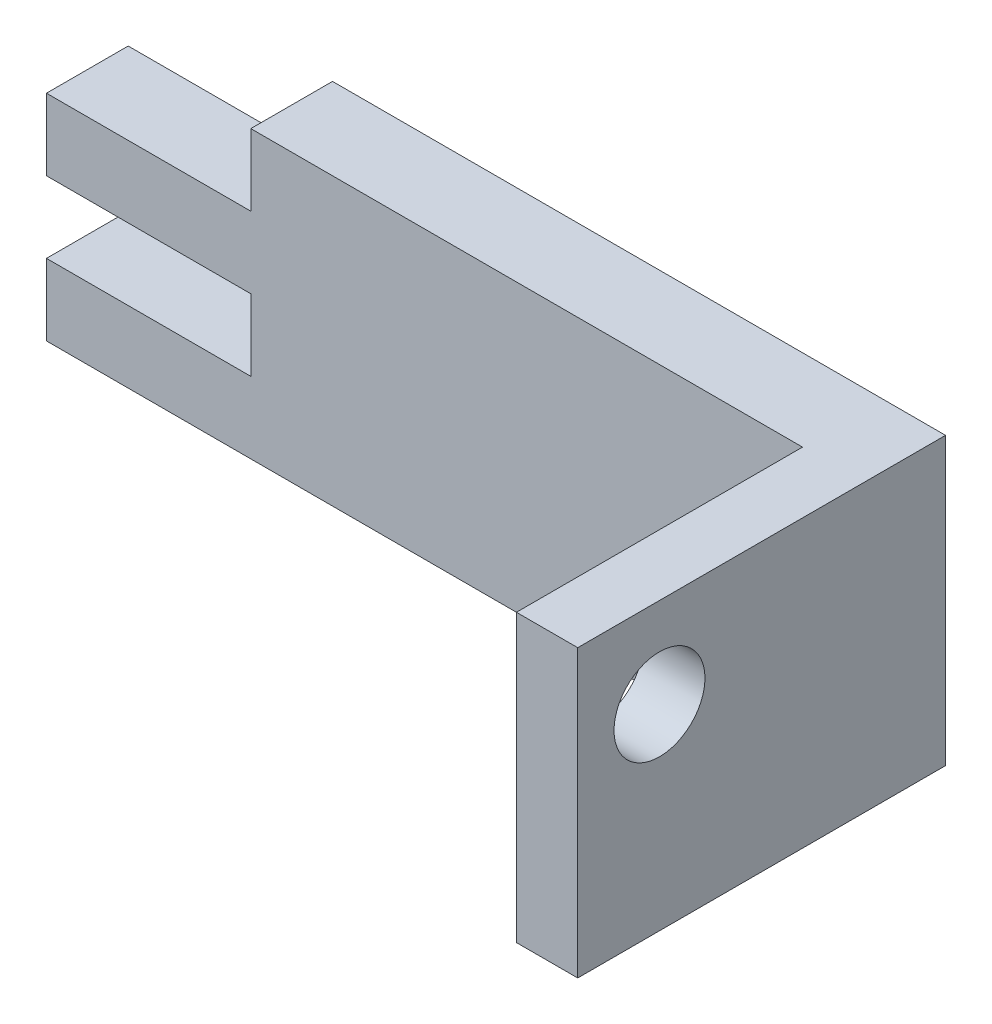
ISO-10303-21;
HEADER;
FILE_DESCRIPTION(('STEP AP214'),'2;1');
FILE_NAME('part.step','',(''),(''),'','','');
FILE_SCHEMA(('AUTOMOTIVE_DESIGN { 1 0 10303 214 1 1 1 1 }'));
ENDSEC;
DATA;
#1=APPLICATION_CONTEXT('core data for automotive mechanical design processes');
#2=APPLICATION_PROTOCOL_DEFINITION('international standard','automotive_design',2000,#1);
#3=PRODUCT_CONTEXT('',#1,'mechanical');
#4=PRODUCT('Part','Part','',(#3));
#5=PRODUCT_RELATED_PRODUCT_CATEGORY('part','',(#4));
#6=PRODUCT_DEFINITION_FORMATION('','',#4);
#7=PRODUCT_DEFINITION_CONTEXT('part definition',#1,'design');
#8=PRODUCT_DEFINITION('design','',#6,#7);
#9=PRODUCT_DEFINITION_SHAPE('','',#8);
#10=(LENGTH_UNIT() NAMED_UNIT(*) SI_UNIT(.MILLI.,.METRE.));
#11=(NAMED_UNIT(*) PLANE_ANGLE_UNIT() SI_UNIT($,.RADIAN.));
#12=(NAMED_UNIT(*) SI_UNIT($,.STERADIAN.) SOLID_ANGLE_UNIT());
#13=UNCERTAINTY_MEASURE_WITH_UNIT(LENGTH_MEASURE(1.E-05),#10,'distance_accuracy_value','');
#14=(GEOMETRIC_REPRESENTATION_CONTEXT(3) GLOBAL_UNCERTAINTY_ASSIGNED_CONTEXT((#13)) GLOBAL_UNIT_ASSIGNED_CONTEXT((#10,
#11,#12)) REPRESENTATION_CONTEXT('',''));
#15=CARTESIAN_POINT('',(0.,0.,0.));
#16=DIRECTION('',(0.,0.,1.));
#17=DIRECTION('',(1.,0.,0.));
#18=AXIS2_PLACEMENT_3D('',#15,#16,#17);
#19=CARTESIAN_POINT('',(-175.,70.,-45.));
#20=DIRECTION('',(0.,0.,1.));
#21=DIRECTION('',(1.,0.,0.));
#22=AXIS2_PLACEMENT_3D('',#19,#20,#21);
#23=PLANE('',#22);
#24=CARTESIAN_POINT('',(143.5,21.5,-45.));
#25=DIRECTION('',(0.,0.,-1.));
#26=DIRECTION('',(-1.,0.,0.));
#27=AXIS2_PLACEMENT_3D('',#24,#25,#26);
#28=CIRCLE('',#27,11.075);
#29=CARTESIAN_POINT('',(132.425,21.5,-45.));
#30=VERTEX_POINT('',#29);
#31=EDGE_CURVE('E167',#30,#30,#28,.T.);
#32=ORIENTED_EDGE('',*,*,#31,.F.);
#33=EDGE_LOOP('',(#32));
#34=FACE_BOUND('',#33,.T.);
#35=DIRECTION('',(0.,1.,0.));
#36=VECTOR('',#35,1.);
#37=CARTESIAN_POINT('',(25.,0.,-45.));
#38=LINE('',#37,#36);
#39=CARTESIAN_POINT('',(25.,52.5,-45.));
#40=VERTEX_POINT('',#39);
#41=CARTESIAN_POINT('',(25.,70.,-45.));
#42=VERTEX_POINT('',#41);
#43=EDGE_CURVE('E143',#40,#42,#38,.T.);
#44=ORIENTED_EDGE('',*,*,#43,.T.);
#45=DIRECTION('',(-1.,0.,0.));
#46=VECTOR('',#45,1.);
#47=CARTESIAN_POINT('',(-175.,70.,-45.));
#48=LINE('',#47,#46);
#49=CARTESIAN_POINT('',(175.,70.,-45.));
#50=VERTEX_POINT('',#49);
#51=EDGE_CURVE('E205',#50,#42,#48,.T.);
#52=ORIENTED_EDGE('',*,*,#51,.F.);
#53=DIRECTION('',(0.,-1.,0.));
#54=VECTOR('',#53,1.);
#55=CARTESIAN_POINT('',(175.,70.,-45.));
#56=LINE('',#55,#54);
#57=CARTESIAN_POINT('',(175.,0.,-45.));
#58=VERTEX_POINT('',#57);
#59=EDGE_CURVE('E219',#50,#58,#56,.T.);
#60=ORIENTED_EDGE('',*,*,#59,.T.);
#61=DIRECTION('',(-1.,0.,0.));
#62=VECTOR('',#61,1.);
#63=CARTESIAN_POINT('',(-175.,0.,-45.));
#64=LINE('',#63,#62);
#65=CARTESIAN_POINT('',(-25.,0.,-45.));
#66=VERTEX_POINT('',#65);
#67=EDGE_CURVE('E213',#58,#66,#64,.T.);
#68=ORIENTED_EDGE('',*,*,#67,.T.);
#69=DIRECTION('',(0.,1.,0.));
#70=VECTOR('',#69,1.);
#71=CARTESIAN_POINT('',(-25.,0.,-45.));
#72=LINE('',#71,#70);
#73=CARTESIAN_POINT('',(-25.,17.5,-45.));
#74=VERTEX_POINT('',#73);
#75=EDGE_CURVE('E140',#66,#74,#72,.T.);
#76=ORIENTED_EDGE('',*,*,#75,.T.);
#77=DIRECTION('',(1.,0.,0.));
#78=VECTOR('',#77,1.);
#79=CARTESIAN_POINT('',(0.,17.5,-45.));
#80=LINE('',#79,#78);
#81=CARTESIAN_POINT('',(25.,17.5,-45.));
#82=VERTEX_POINT('',#81);
#83=EDGE_CURVE('E161',#74,#82,#80,.T.);
#84=ORIENTED_EDGE('',*,*,#83,.T.);
#85=DIRECTION('',(0.,1.,0.));
#86=VECTOR('',#85,1.);
#87=CARTESIAN_POINT('',(25.,0.,-45.));
#88=LINE('',#87,#86);
#89=CARTESIAN_POINT('',(25.,35.,-45.));
#90=VERTEX_POINT('',#89);
#91=EDGE_CURVE('E158',#82,#90,#88,.T.);
#92=ORIENTED_EDGE('',*,*,#91,.T.);
#93=DIRECTION('',(-1.,0.,0.));
#94=VECTOR('',#93,1.);
#95=CARTESIAN_POINT('',(0.,35.,-45.));
#96=LINE('',#95,#94);
#97=CARTESIAN_POINT('',(-25.,35.,-45.));
#98=VERTEX_POINT('',#97);
#99=EDGE_CURVE('E154',#90,#98,#96,.T.);
#100=ORIENTED_EDGE('',*,*,#99,.T.);
#101=DIRECTION('',(0.,1.,0.));
#102=VECTOR('',#101,1.);
#103=CARTESIAN_POINT('',(-25.,0.,-45.));
#104=LINE('',#103,#102);
#105=CARTESIAN_POINT('',(-25.,52.5,-45.));
#106=VERTEX_POINT('',#105);
#107=EDGE_CURVE('E152',#98,#106,#104,.T.);
#108=ORIENTED_EDGE('',*,*,#107,.T.);
#109=DIRECTION('',(1.,0.,0.));
#110=VECTOR('',#109,1.);
#111=CARTESIAN_POINT('',(0.,52.5,-45.));
#112=LINE('',#111,#110);
#113=EDGE_CURVE('E134',#106,#40,#112,.T.);
#114=ORIENTED_EDGE('',*,*,#113,.T.);
#115=EDGE_LOOP('',(#44,#52,#60,#68,#76,#84,#92,#100,#108,#114));
#116=FACE_BOUND('',#115,.T.);
#117=ADVANCED_FACE('F43',(#34,#116),#23,.F.);
#118=CARTESIAN_POINT('',(0.,70.,0.));
#119=DIRECTION('',(0.,1.,0.));
#120=DIRECTION('',(0.,0.,1.));
#121=AXIS2_PLACEMENT_3D('',#118,#119,#120);
#122=PLANE('',#121);
#123=ORIENTED_EDGE('',*,*,#51,.T.);
#124=DIRECTION('',(0.,0.,-1.));
#125=VECTOR('',#124,1.);
#126=CARTESIAN_POINT('',(25.,70.,45.));
#127=LINE('',#126,#125);
#128=CARTESIAN_POINT('',(25.,70.,-25.));
#129=VERTEX_POINT('',#128);
#130=EDGE_CURVE('E146',#129,#42,#127,.T.);
#131=ORIENTED_EDGE('',*,*,#130,.F.);
#132=DIRECTION('',(-1.,0.,0.));
#133=VECTOR('',#132,1.);
#134=CARTESIAN_POINT('',(-160.,70.,-25.));
#135=LINE('',#134,#133);
#136=CARTESIAN_POINT('',(160.,70.,-25.));
#137=VERTEX_POINT('',#136);
#138=EDGE_CURVE('E190',#137,#129,#135,.T.);
#139=ORIENTED_EDGE('',*,*,#138,.F.);
#140=DIRECTION('',(0.,0.,-1.));
#141=VECTOR('',#140,1.);
#142=CARTESIAN_POINT('',(160.,70.,-25.));
#143=LINE('',#142,#141);
#144=CARTESIAN_POINT('',(160.,70.,45.));
#145=VERTEX_POINT('',#144);
#146=EDGE_CURVE('E193',#145,#137,#143,.T.);
#147=ORIENTED_EDGE('',*,*,#146,.F.);
#148=DIRECTION('',(1.,0.,0.));
#149=VECTOR('',#148,1.);
#150=CARTESIAN_POINT('',(-175.,70.,45.));
#151=LINE('',#150,#149);
#152=CARTESIAN_POINT('',(175.,70.,45.));
#153=VERTEX_POINT('',#152);
#154=EDGE_CURVE('E208',#145,#153,#151,.T.);
#155=ORIENTED_EDGE('',*,*,#154,.T.);
#156=DIRECTION('',(0.,0.,-1.));
#157=VECTOR('',#156,1.);
#158=CARTESIAN_POINT('',(175.,70.,-45.));
#159=LINE('',#158,#157);
#160=EDGE_CURVE('E202',#153,#50,#159,.T.);
#161=ORIENTED_EDGE('',*,*,#160,.T.);
#162=EDGE_LOOP('',(#123,#131,#139,#147,#155,#161));
#163=FACE_BOUND('',#162,.T.);
#164=ADVANCED_FACE('F268',(#163),#122,.T.);
#165=CARTESIAN_POINT('',(0.,0.,0.));
#166=DIRECTION('',(0.,1.,0.));
#167=DIRECTION('',(0.,0.,1.));
#168=AXIS2_PLACEMENT_3D('',#165,#166,#167);
#169=PLANE('',#168);
#170=DIRECTION('',(0.,0.,-1.));
#171=VECTOR('',#170,1.);
#172=CARTESIAN_POINT('',(-25.,0.,45.));
#173=LINE('',#172,#171);
#174=CARTESIAN_POINT('',(-25.,0.,-25.));
#175=VERTEX_POINT('',#174);
#176=EDGE_CURVE('E168',#175,#66,#173,.T.);
#177=ORIENTED_EDGE('',*,*,#176,.T.);
#178=ORIENTED_EDGE('',*,*,#67,.F.);
#179=DIRECTION('',(0.,0.,-1.));
#180=VECTOR('',#179,1.);
#181=CARTESIAN_POINT('',(175.,0.,-45.));
#182=LINE('',#181,#180);
#183=CARTESIAN_POINT('',(175.,0.,45.));
#184=VERTEX_POINT('',#183);
#185=EDGE_CURVE('E200',#184,#58,#182,.T.);
#186=ORIENTED_EDGE('',*,*,#185,.F.);
#187=DIRECTION('',(1.,0.,0.));
#188=VECTOR('',#187,1.);
#189=CARTESIAN_POINT('',(-175.,0.,45.));
#190=LINE('',#189,#188);
#191=CARTESIAN_POINT('',(160.,0.,45.));
#192=VERTEX_POINT('',#191);
#193=EDGE_CURVE('E206',#192,#184,#190,.T.);
#194=ORIENTED_EDGE('',*,*,#193,.F.);
#195=DIRECTION('',(0.,0.,-1.));
#196=VECTOR('',#195,1.);
#197=CARTESIAN_POINT('',(160.,0.,-25.));
#198=LINE('',#197,#196);
#199=CARTESIAN_POINT('',(160.,0.,-25.));
#200=VERTEX_POINT('',#199);
#201=EDGE_CURVE('E187',#192,#200,#198,.T.);
#202=ORIENTED_EDGE('',*,*,#201,.T.);
#203=DIRECTION('',(-1.,0.,0.));
#204=VECTOR('',#203,1.);
#205=CARTESIAN_POINT('',(-160.,0.,-25.));
#206=LINE('',#205,#204);
#207=EDGE_CURVE('E66',#200,#175,#206,.T.);
#208=ORIENTED_EDGE('',*,*,#207,.T.);
#209=EDGE_LOOP('',(#177,#178,#186,#194,#202,#208));
#210=FACE_BOUND('',#209,.T.);
#211=ADVANCED_FACE('F255',(#210),#169,.F.);
#212=CARTESIAN_POINT('',(-160.,0.,-25.));
#213=DIRECTION('',(0.,0.,-1.));
#214=DIRECTION('',(-1.,0.,0.));
#215=AXIS2_PLACEMENT_3D('',#212,#213,#214);
#216=PLANE('',#215);
#217=CARTESIAN_POINT('',(143.5,21.5,-25.));
#218=DIRECTION('',(0.,0.,-1.));
#219=DIRECTION('',(-1.,0.,0.));
#220=AXIS2_PLACEMENT_3D('',#217,#218,#219);
#221=CIRCLE('',#220,11.075);
#222=CARTESIAN_POINT('',(132.425,21.5,-25.));
#223=VERTEX_POINT('',#222);
#224=EDGE_CURVE('E182',#223,#223,#221,.T.);
#225=ORIENTED_EDGE('',*,*,#224,.T.);
#226=EDGE_LOOP('',(#225));
#227=FACE_BOUND('',#226,.T.);
#228=DIRECTION('',(0.,1.,0.));
#229=VECTOR('',#228,1.);
#230=CARTESIAN_POINT('',(25.,0.,-25.));
#231=LINE('',#230,#229);
#232=CARTESIAN_POINT('',(25.,52.5,-25.));
#233=VERTEX_POINT('',#232);
#234=EDGE_CURVE('E11',#233,#129,#231,.T.);
#235=ORIENTED_EDGE('',*,*,#234,.F.);
#236=DIRECTION('',(1.,0.,0.));
#237=VECTOR('',#236,1.);
#238=CARTESIAN_POINT('',(-160.,52.5000000000001,-25.));
#239=LINE('',#238,#237);
#240=CARTESIAN_POINT('',(-25.,52.5,-25.));
#241=VERTEX_POINT('',#240);
#242=EDGE_CURVE('E137',#241,#233,#239,.T.);
#243=ORIENTED_EDGE('',*,*,#242,.F.);
#244=DIRECTION('',(0.,1.,0.));
#245=VECTOR('',#244,1.);
#246=CARTESIAN_POINT('',(-25.,0.,-25.));
#247=LINE('',#246,#245);
#248=CARTESIAN_POINT('',(-25.,35.,-25.));
#249=VERTEX_POINT('',#248);
#250=EDGE_CURVE('E227',#249,#241,#247,.T.);
#251=ORIENTED_EDGE('',*,*,#250,.F.);
#252=DIRECTION('',(-1.,0.,0.));
#253=VECTOR('',#252,1.);
#254=CARTESIAN_POINT('',(-160.,35.,-25.));
#255=LINE('',#254,#253);
#256=CARTESIAN_POINT('',(25.,35.,-25.));
#257=VERTEX_POINT('',#256);
#258=EDGE_CURVE('E229',#257,#249,#255,.T.);
#259=ORIENTED_EDGE('',*,*,#258,.F.);
#260=DIRECTION('',(0.,1.,0.));
#261=VECTOR('',#260,1.);
#262=CARTESIAN_POINT('',(25.,0.,-25.));
#263=LINE('',#262,#261);
#264=CARTESIAN_POINT('',(25.,17.5,-25.));
#265=VERTEX_POINT('',#264);
#266=EDGE_CURVE('E231',#265,#257,#263,.T.);
#267=ORIENTED_EDGE('',*,*,#266,.F.);
#268=DIRECTION('',(1.,0.,0.));
#269=VECTOR('',#268,1.);
#270=CARTESIAN_POINT('',(-160.,17.5,-25.));
#271=LINE('',#270,#269);
#272=CARTESIAN_POINT('',(-25.,17.5,-25.));
#273=VERTEX_POINT('',#272);
#274=EDGE_CURVE('E233',#273,#265,#271,.T.);
#275=ORIENTED_EDGE('',*,*,#274,.F.);
#276=DIRECTION('',(0.,1.,0.));
#277=VECTOR('',#276,1.);
#278=CARTESIAN_POINT('',(-25.,0.,-25.));
#279=LINE('',#278,#277);
#280=EDGE_CURVE('E51',#175,#273,#279,.T.);
#281=ORIENTED_EDGE('',*,*,#280,.F.);
#282=ORIENTED_EDGE('',*,*,#207,.F.);
#283=DIRECTION('',(0.,1.,0.));
#284=VECTOR('',#283,1.);
#285=CARTESIAN_POINT('',(160.,0.,-25.));
#286=LINE('',#285,#284);
#287=EDGE_CURVE('E198',#200,#137,#286,.T.);
#288=ORIENTED_EDGE('',*,*,#287,.T.);
#289=ORIENTED_EDGE('',*,*,#138,.T.);
#290=EDGE_LOOP('',(#235,#243,#251,#259,#267,#275,#281,#282,#288,#289));
#291=FACE_BOUND('',#290,.T.);
#292=ADVANCED_FACE('F243',(#227,#291),#216,.F.);
#293=CARTESIAN_POINT('',(175.,70.,-45.));
#294=DIRECTION('',(-1.,0.,0.));
#295=DIRECTION('',(0.,0.,1.));
#296=AXIS2_PLACEMENT_3D('',#293,#294,#295);
#297=PLANE('',#296);
#298=CARTESIAN_POINT('',(175.,48.,25.));
#299=DIRECTION('',(-1.,0.,0.));
#300=DIRECTION('',(0.,0.,1.));
#301=AXIS2_PLACEMENT_3D('',#298,#299,#300);
#302=CIRCLE('',#301,11.125);
#303=CARTESIAN_POINT('',(175.,48.,36.125));
#304=VERTEX_POINT('',#303);
#305=EDGE_CURVE('E183',#304,#304,#302,.T.);
#306=ORIENTED_EDGE('',*,*,#305,.T.);
#307=EDGE_LOOP('',(#306));
#308=FACE_BOUND('',#307,.T.);
#309=ORIENTED_EDGE('',*,*,#185,.T.);
#310=ORIENTED_EDGE('',*,*,#59,.F.);
#311=ORIENTED_EDGE('',*,*,#160,.F.);
#312=DIRECTION('',(0.,-1.,0.));
#313=VECTOR('',#312,1.);
#314=CARTESIAN_POINT('',(175.,70.,45.));
#315=LINE('',#314,#313);
#316=EDGE_CURVE('E210',#153,#184,#315,.T.);
#317=ORIENTED_EDGE('',*,*,#316,.T.);
#318=EDGE_LOOP('',(#309,#310,#311,#317));
#319=FACE_BOUND('',#318,.T.);
#320=ADVANCED_FACE('F45',(#308,#319),#297,.F.);
#321=CARTESIAN_POINT('',(-175.,70.,45.));
#322=DIRECTION('',(0.,0.,-1.));
#323=DIRECTION('',(-1.,0.,0.));
#324=AXIS2_PLACEMENT_3D('',#321,#322,#323);
#325=PLANE('',#324);
#326=ORIENTED_EDGE('',*,*,#154,.F.);
#327=DIRECTION('',(0.,1.,0.));
#328=VECTOR('',#327,1.);
#329=CARTESIAN_POINT('',(160.,0.,45.));
#330=LINE('',#329,#328);
#331=EDGE_CURVE('E192',#192,#145,#330,.T.);
#332=ORIENTED_EDGE('',*,*,#331,.F.);
#333=ORIENTED_EDGE('',*,*,#193,.T.);
#334=ORIENTED_EDGE('',*,*,#316,.F.);
#335=EDGE_LOOP('',(#326,#332,#333,#334));
#336=FACE_BOUND('',#335,.T.);
#337=ADVANCED_FACE('F264',(#336),#325,.F.);
#338=CARTESIAN_POINT('',(160.,0.,-25.));
#339=DIRECTION('',(1.,0.,0.));
#340=DIRECTION('',(0.,0.,-1.));
#341=AXIS2_PLACEMENT_3D('',#338,#339,#340);
#342=PLANE('',#341);
#343=CARTESIAN_POINT('',(160.,48.,25.));
#344=DIRECTION('',(1.,0.,0.));
#345=DIRECTION('',(0.,0.,-1.));
#346=AXIS2_PLACEMENT_3D('',#343,#344,#345);
#347=CIRCLE('',#346,11.125);
#348=CARTESIAN_POINT('',(160.,48.,13.875));
#349=VERTEX_POINT('',#348);
#350=EDGE_CURVE('E186',#349,#349,#347,.T.);
#351=ORIENTED_EDGE('',*,*,#350,.T.);
#352=EDGE_LOOP('',(#351));
#353=FACE_BOUND('',#352,.T.);
#354=ORIENTED_EDGE('',*,*,#146,.T.);
#355=ORIENTED_EDGE('',*,*,#287,.F.);
#356=ORIENTED_EDGE('',*,*,#201,.F.);
#357=ORIENTED_EDGE('',*,*,#331,.T.);
#358=EDGE_LOOP('',(#354,#355,#356,#357));
#359=FACE_BOUND('',#358,.T.);
#360=ADVANCED_FACE('F260',(#353,#359),#342,.F.);
#361=CARTESIAN_POINT('',(175.,48.,25.));
#362=DIRECTION('',(-1.,0.,0.));
#363=DIRECTION('',(0.,0.,1.));
#364=AXIS2_PLACEMENT_3D('',#361,#362,#363);
#365=CYLINDRICAL_SURFACE('',#364,11.125);
#366=ORIENTED_EDGE('',*,*,#305,.F.);
#367=EDGE_LOOP('',(#366));
#368=FACE_BOUND('',#367,.T.);
#369=ORIENTED_EDGE('',*,*,#350,.F.);
#370=EDGE_LOOP('',(#369));
#371=FACE_BOUND('',#370,.T.);
#372=ADVANCED_FACE('F296',(#368,#371),#365,.F.);
#373=CARTESIAN_POINT('',(143.5,21.5,45.));
#374=DIRECTION('',(0.,0.,-1.));
#375=DIRECTION('',(-1.,0.,0.));
#376=AXIS2_PLACEMENT_3D('',#373,#374,#375);
#377=CYLINDRICAL_SURFACE('',#376,11.075);
#378=CARTESIAN_POINT('',(132.425,21.5,-45.));
#379=CARTESIAN_POINT('',(132.425,21.5,-44.7916666666667));
#380=CARTESIAN_POINT('',(132.425,21.5,-44.5833333333333));
#381=CARTESIAN_POINT('',(132.425,21.5,-44.1666666666667));
#382=CARTESIAN_POINT('',(132.425,21.5,-43.9583333333333));
#383=CARTESIAN_POINT('',(132.425,21.5,-43.5416666666667));
#384=CARTESIAN_POINT('',(132.425,21.5,-43.3333333333333));
#385=CARTESIAN_POINT('',(132.425,21.5,-42.9166666666667));
#386=CARTESIAN_POINT('',(132.425,21.5,-42.7083333333333));
#387=CARTESIAN_POINT('',(132.425,21.5,-42.2916666666667));
#388=CARTESIAN_POINT('',(132.425,21.5,-42.0833333333333));
#389=CARTESIAN_POINT('',(132.425,21.5,-41.6666666666667));
#390=CARTESIAN_POINT('',(132.425,21.5,-41.4583333333333));
#391=CARTESIAN_POINT('',(132.425,21.5,-41.0416666666667));
#392=CARTESIAN_POINT('',(132.425,21.5,-40.8333333333333));
#393=CARTESIAN_POINT('',(132.425,21.5,-40.4166666666667));
#394=CARTESIAN_POINT('',(132.425,21.5,-40.2083333333333));
#395=CARTESIAN_POINT('',(132.425,21.5,-39.7916666666667));
#396=CARTESIAN_POINT('',(132.425,21.5,-39.5833333333333));
#397=CARTESIAN_POINT('',(132.425,21.5,-39.1666666666667));
#398=CARTESIAN_POINT('',(132.425,21.5,-38.9583333333333));
#399=CARTESIAN_POINT('',(132.425,21.5,-38.5416666666667));
#400=CARTESIAN_POINT('',(132.425,21.5,-38.3333333333333));
#401=CARTESIAN_POINT('',(132.425,21.5,-37.9166666666667));
#402=CARTESIAN_POINT('',(132.425,21.5,-37.7083333333333));
#403=CARTESIAN_POINT('',(132.425,21.5,-37.2916666666667));
#404=CARTESIAN_POINT('',(132.425,21.5,-37.0833333333333));
#405=CARTESIAN_POINT('',(132.425,21.5,-36.6666666666667));
#406=CARTESIAN_POINT('',(132.425,21.5,-36.4583333333333));
#407=CARTESIAN_POINT('',(132.425,21.5,-36.0416666666667));
#408=CARTESIAN_POINT('',(132.425,21.5,-35.8333333333333));
#409=CARTESIAN_POINT('',(132.425,21.5,-35.4166666666667));
#410=CARTESIAN_POINT('',(132.425,21.5,-35.2083333333333));
#411=CARTESIAN_POINT('',(132.425,21.5,-34.7916666666667));
#412=CARTESIAN_POINT('',(132.425,21.5,-34.5833333333333));
#413=CARTESIAN_POINT('',(132.425,21.5,-34.1666666666667));
#414=CARTESIAN_POINT('',(132.425,21.5,-33.9583333333333));
#415=CARTESIAN_POINT('',(132.425,21.5,-33.5416666666667));
#416=CARTESIAN_POINT('',(132.425,21.5,-33.3333333333333));
#417=CARTESIAN_POINT('',(132.425,21.5,-32.9166666666667));
#418=CARTESIAN_POINT('',(132.425,21.5,-32.7083333333333));
#419=CARTESIAN_POINT('',(132.425,21.5,-32.2916666666667));
#420=CARTESIAN_POINT('',(132.425,21.5,-32.0833333333333));
#421=CARTESIAN_POINT('',(132.425,21.5,-31.6666666666667));
#422=CARTESIAN_POINT('',(132.425,21.5,-31.4583333333333));
#423=CARTESIAN_POINT('',(132.425,21.5,-31.0416666666667));
#424=CARTESIAN_POINT('',(132.425,21.5,-30.8333333333333));
#425=CARTESIAN_POINT('',(132.425,21.5,-30.4166666666667));
#426=CARTESIAN_POINT('',(132.425,21.5,-30.2083333333333));
#427=CARTESIAN_POINT('',(132.425,21.5,-29.7916666666667));
#428=CARTESIAN_POINT('',(132.425,21.5,-29.5833333333333));
#429=CARTESIAN_POINT('',(132.425,21.5,-29.1666666666667));
#430=CARTESIAN_POINT('',(132.425,21.5,-28.9583333333333));
#431=CARTESIAN_POINT('',(132.425,21.5,-28.5416666666667));
#432=CARTESIAN_POINT('',(132.425,21.5,-28.3333333333333));
#433=CARTESIAN_POINT('',(132.425,21.5,-27.9166666666667));
#434=CARTESIAN_POINT('',(132.425,21.5,-27.7083333333333));
#435=CARTESIAN_POINT('',(132.425,21.5,-27.2916666666667));
#436=CARTESIAN_POINT('',(132.425,21.5,-27.0833333333333));
#437=CARTESIAN_POINT('',(132.425,21.5,-26.6666666666667));
#438=CARTESIAN_POINT('',(132.425,21.5,-26.4583333333333));
#439=CARTESIAN_POINT('',(132.425,21.5,-26.0416666666667));
#440=CARTESIAN_POINT('',(132.425,21.5,-25.8333333333333));
#441=CARTESIAN_POINT('',(132.425,21.5,-25.4166666666667));
#442=CARTESIAN_POINT('',(132.425,21.5,-25.2083333333333));
#443=CARTESIAN_POINT('',(132.425,21.5,-25.));
#444=B_SPLINE_CURVE_WITH_KNOTS('',3,(#378,#379,#380,#381,#382,#383,#384,#385,#386,#387,#388,
#389,#390,#391,#392,#393,#394,#395,#396,#397,#398,#399,#400,#401,#402,#403,#404,#405,#406,#407,
#408,#409,#410,#411,#412,#413,#414,#415,#416,#417,#418,#419,#420,#421,#422,#423,#424,#425,#426,
#427,#428,#429,#430,#431,#432,#433,#434,#435,#436,#437,#438,#439,#440,#441,#442,#443),
.UNSPECIFIED.,.F.,.F.,(4,2,2,2,2,2,2,2,2,2,2,2,2,2,2,2,2,2,2,2,2,2,2,2,2,2,2,2,2,2,2,2,4),(0.,
0.625000000000001,1.25,1.875,2.5,3.125,3.75,4.375,5.,5.62499999999999,6.24999999999999,
6.87499999999999,7.49999999999999,8.12499999999999,8.74999999999999,9.37499999999999,
9.99999999999999,10.625,11.25,11.875,12.5,13.125,13.75,14.375,15.,15.625,16.25,16.875,17.5,
18.125,18.75,19.375,20.),.UNSPECIFIED.);
#445=EDGE_CURVE('BSEAM303',#30,#223,#444,.T.);
#446=ORIENTED_EDGE('',*,*,#31,.T.);
#447=ORIENTED_EDGE('',*,*,#224,.F.);
#448=ORIENTED_EDGE('',*,*,#445,.T.);
#449=ORIENTED_EDGE('',*,*,#445,.F.);
#450=EDGE_LOOP('',(#446,#448,#447,#449));
#451=FACE_BOUND('',#450,.T.);
#452=ADVANCED_FACE('F303',(#451),#377,.F.);
#453=CARTESIAN_POINT('',(25.,0.,45.));
#454=DIRECTION('',(-1.,0.,0.));
#455=DIRECTION('',(0.,0.,1.));
#456=AXIS2_PLACEMENT_3D('',#453,#454,#455);
#457=PLANE('',#456);
#458=ORIENTED_EDGE('',*,*,#234,.T.);
#459=ORIENTED_EDGE('',*,*,#130,.T.);
#460=ORIENTED_EDGE('',*,*,#43,.F.);
#461=DIRECTION('',(0.,0.,-1.));
#462=VECTOR('',#461,1.);
#463=CARTESIAN_POINT('',(25.,52.5,45.));
#464=LINE('',#463,#462);
#465=EDGE_CURVE('E130',#233,#40,#464,.T.);
#466=ORIENTED_EDGE('',*,*,#465,.F.);
#467=EDGE_LOOP('',(#458,#459,#460,#466));
#468=FACE_BOUND('',#467,.T.);
#469=ADVANCED_FACE('F144',(#468),#457,.T.);
#470=CARTESIAN_POINT('',(-25.,0.,45.));
#471=DIRECTION('',(-1.,0.,0.));
#472=DIRECTION('',(0.,0.,1.));
#473=AXIS2_PLACEMENT_3D('',#470,#471,#472);
#474=PLANE('',#473);
#475=ORIENTED_EDGE('',*,*,#280,.T.);
#476=DIRECTION('',(0.,0.,-1.));
#477=VECTOR('',#476,1.);
#478=CARTESIAN_POINT('',(-25.,17.5,45.));
#479=LINE('',#478,#477);
#480=EDGE_CURVE('E171',#273,#74,#479,.T.);
#481=ORIENTED_EDGE('',*,*,#480,.T.);
#482=ORIENTED_EDGE('',*,*,#75,.F.);
#483=ORIENTED_EDGE('',*,*,#176,.F.);
#484=EDGE_LOOP('',(#475,#481,#482,#483));
#485=FACE_BOUND('',#484,.T.);
#486=ADVANCED_FACE('F236',(#485),#474,.T.);
#487=CARTESIAN_POINT('',(0.,17.5,45.));
#488=DIRECTION('',(0.,1.,0.));
#489=DIRECTION('',(-1.,0.,0.));
#490=AXIS2_PLACEMENT_3D('',#487,#488,#489);
#491=PLANE('',#490);
#492=ORIENTED_EDGE('',*,*,#274,.T.);
#493=DIRECTION('',(0.,0.,-1.));
#494=VECTOR('',#493,1.);
#495=CARTESIAN_POINT('',(25.,17.5,45.));
#496=LINE('',#495,#494);
#497=EDGE_CURVE('E173',#265,#82,#496,.T.);
#498=ORIENTED_EDGE('',*,*,#497,.T.);
#499=ORIENTED_EDGE('',*,*,#83,.F.);
#500=ORIENTED_EDGE('',*,*,#480,.F.);
#501=EDGE_LOOP('',(#492,#498,#499,#500));
#502=FACE_BOUND('',#501,.T.);
#503=ADVANCED_FACE('F240',(#502),#491,.T.);
#504=CARTESIAN_POINT('',(25.,0.,45.));
#505=DIRECTION('',(-1.,0.,0.));
#506=DIRECTION('',(0.,0.,1.));
#507=AXIS2_PLACEMENT_3D('',#504,#505,#506);
#508=PLANE('',#507);
#509=ORIENTED_EDGE('',*,*,#266,.T.);
#510=DIRECTION('',(0.,0.,-1.));
#511=VECTOR('',#510,1.);
#512=CARTESIAN_POINT('',(25.,35.,45.));
#513=LINE('',#512,#511);
#514=EDGE_CURVE('E175',#257,#90,#513,.T.);
#515=ORIENTED_EDGE('',*,*,#514,.T.);
#516=ORIENTED_EDGE('',*,*,#91,.F.);
#517=ORIENTED_EDGE('',*,*,#497,.F.);
#518=EDGE_LOOP('',(#509,#515,#516,#517));
#519=FACE_BOUND('',#518,.T.);
#520=ADVANCED_FACE('F248',(#519),#508,.T.);
#521=CARTESIAN_POINT('',(0.,35.,45.));
#522=DIRECTION('',(0.,-1.,0.));
#523=DIRECTION('',(0.,0.,-1.));
#524=AXIS2_PLACEMENT_3D('',#521,#522,#523);
#525=PLANE('',#524);
#526=ORIENTED_EDGE('',*,*,#258,.T.);
#527=DIRECTION('',(0.,0.,-1.));
#528=VECTOR('',#527,1.);
#529=CARTESIAN_POINT('',(-25.,35.,45.));
#530=LINE('',#529,#528);
#531=EDGE_CURVE('E177',#249,#98,#530,.T.);
#532=ORIENTED_EDGE('',*,*,#531,.T.);
#533=ORIENTED_EDGE('',*,*,#99,.F.);
#534=ORIENTED_EDGE('',*,*,#514,.F.);
#535=EDGE_LOOP('',(#526,#532,#533,#534));
#536=FACE_BOUND('',#535,.T.);
#537=ADVANCED_FACE('F252',(#536),#525,.T.);
#538=CARTESIAN_POINT('',(-25.,0.,45.));
#539=DIRECTION('',(-1.,0.,0.));
#540=DIRECTION('',(0.,0.,1.));
#541=AXIS2_PLACEMENT_3D('',#538,#539,#540);
#542=PLANE('',#541);
#543=ORIENTED_EDGE('',*,*,#250,.T.);
#544=DIRECTION('',(0.,0.,-1.));
#545=VECTOR('',#544,1.);
#546=CARTESIAN_POINT('',(-25.,52.5,45.));
#547=LINE('',#546,#545);
#548=EDGE_CURVE('E58',#241,#106,#547,.T.);
#549=ORIENTED_EDGE('',*,*,#548,.T.);
#550=ORIENTED_EDGE('',*,*,#107,.F.);
#551=ORIENTED_EDGE('',*,*,#531,.F.);
#552=EDGE_LOOP('',(#543,#549,#550,#551));
#553=FACE_BOUND('',#552,.T.);
#554=ADVANCED_FACE('F272',(#553),#542,.T.);
#555=CARTESIAN_POINT('',(0.,52.5,45.));
#556=DIRECTION('',(0.,1.,0.));
#557=DIRECTION('',(-1.,0.,0.));
#558=AXIS2_PLACEMENT_3D('',#555,#556,#557);
#559=PLANE('',#558);
#560=ORIENTED_EDGE('',*,*,#242,.T.);
#561=ORIENTED_EDGE('',*,*,#465,.T.);
#562=ORIENTED_EDGE('',*,*,#113,.F.);
#563=ORIENTED_EDGE('',*,*,#548,.F.);
#564=EDGE_LOOP('',(#560,#561,#562,#563));
#565=FACE_BOUND('',#564,.T.);
#566=ADVANCED_FACE('F132',(#565),#559,.T.);
#567=CLOSED_SHELL('',(#117,#164,#211,#292,#320,#337,#360,#372,#452,#469,#486,#503,#520,#537,
#554,#566));
#568=MANIFOLD_SOLID_BREP('B2',#567);
#569=ADVANCED_BREP_SHAPE_REPRESENTATION('',(#18,#568),#14);
#570=SHAPE_DEFINITION_REPRESENTATION(#9,#569);
ENDSEC;
END-ISO-10303-21;
